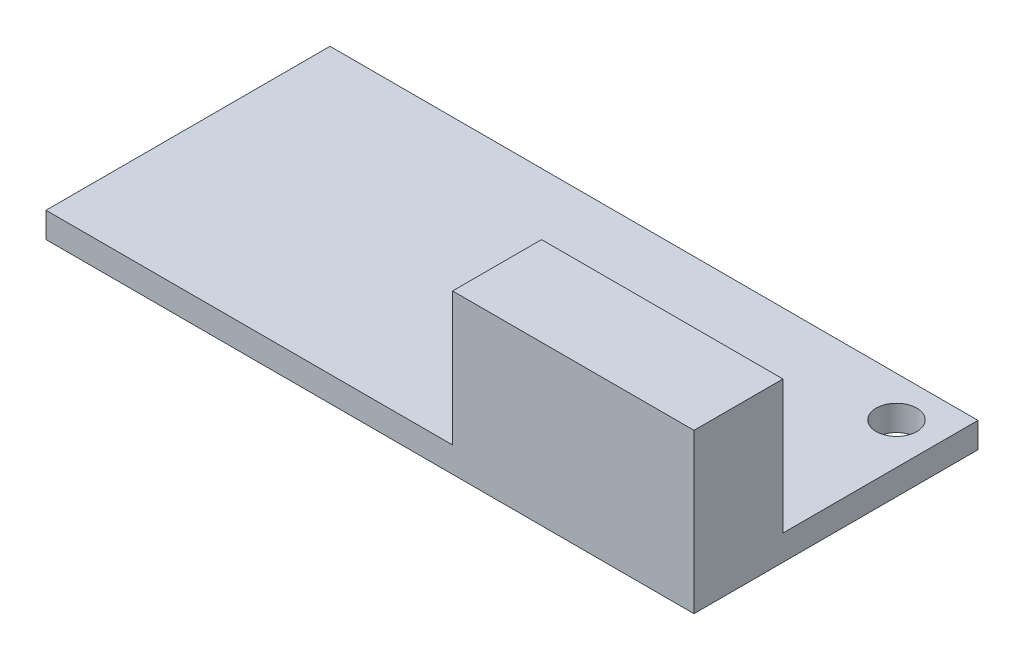
ISO-10303-21;
HEADER;
FILE_DESCRIPTION(('STEP AP214'),'2;1');
FILE_NAME('part.step','',(''),(''),'','','');
FILE_SCHEMA(('AUTOMOTIVE_DESIGN { 1 0 10303 214 1 1 1 1 }'));
ENDSEC;
DATA;
#1=APPLICATION_CONTEXT('core data for automotive mechanical design processes');
#2=APPLICATION_PROTOCOL_DEFINITION('international standard','automotive_design',2000,#1);
#3=PRODUCT_CONTEXT('',#1,'mechanical');
#4=PRODUCT('Part','Part','',(#3));
#5=PRODUCT_RELATED_PRODUCT_CATEGORY('part','',(#4));
#6=PRODUCT_DEFINITION_FORMATION('','',#4);
#7=PRODUCT_DEFINITION_CONTEXT('part definition',#1,'design');
#8=PRODUCT_DEFINITION('design','',#6,#7);
#9=PRODUCT_DEFINITION_SHAPE('','',#8);
#10=(LENGTH_UNIT() NAMED_UNIT(*) SI_UNIT(.MILLI.,.METRE.));
#11=(NAMED_UNIT(*) PLANE_ANGLE_UNIT() SI_UNIT($,.RADIAN.));
#12=(NAMED_UNIT(*) SI_UNIT($,.STERADIAN.) SOLID_ANGLE_UNIT());
#13=UNCERTAINTY_MEASURE_WITH_UNIT(LENGTH_MEASURE(1.E-05),#10,'distance_accuracy_value','');
#14=(GEOMETRIC_REPRESENTATION_CONTEXT(3) GLOBAL_UNCERTAINTY_ASSIGNED_CONTEXT((#13)) GLOBAL_UNIT_ASSIGNED_CONTEXT((#10,
#11,#12)) REPRESENTATION_CONTEXT('',''));
#15=CARTESIAN_POINT('',(0.,0.,0.));
#16=DIRECTION('',(0.,0.,1.));
#17=DIRECTION('',(1.,0.,0.));
#18=AXIS2_PLACEMENT_3D('',#15,#16,#17);
#19=CARTESIAN_POINT('',(0.,2.,0.));
#20=DIRECTION('',(0.,-1.,0.));
#21=DIRECTION('',(0.,0.,-1.));
#22=AXIS2_PLACEMENT_3D('',#19,#20,#21);
#23=PLANE('',#22);
#24=CARTESIAN_POINT('',(22.252,2.,-8.00556240259456));
#25=DIRECTION('',(0.,1.,0.));
#26=DIRECTION('',(0.,0.,1.));
#27=AXIS2_PLACEMENT_3D('',#24,#25,#26);
#28=CIRCLE('',#27,1.6);
#29=CARTESIAN_POINT('',(22.252,2.,-6.40556240259456));
#30=VERTEX_POINT('',#29);
#31=EDGE_CURVE('E174',#30,#30,#28,.T.);
#32=ORIENTED_EDGE('',*,*,#31,.F.);
#33=EDGE_LOOP('',(#32));
#34=FACE_BOUND('',#33,.T.);
#35=DIRECTION('',(0.,0.,1.));
#36=VECTOR('',#35,1.);
#37=CARTESIAN_POINT('',(6.5,2.,11.176));
#38=LINE('',#37,#36);
#39=CARTESIAN_POINT('',(6.5,2.,4.17600000000001));
#40=VERTEX_POINT('',#39);
#41=CARTESIAN_POINT('',(6.5,2.,11.176));
#42=VERTEX_POINT('',#41);
#43=EDGE_CURVE('E153',#40,#42,#38,.T.);
#44=ORIENTED_EDGE('',*,*,#43,.F.);
#45=DIRECTION('',(-1.,0.,0.));
#46=VECTOR('',#45,1.);
#47=CARTESIAN_POINT('',(25.5,2.,4.176));
#48=LINE('',#47,#46);
#49=CARTESIAN_POINT('',(25.5,2.,4.176));
#50=VERTEX_POINT('',#49);
#51=EDGE_CURVE('E148',#50,#40,#48,.T.);
#52=ORIENTED_EDGE('',*,*,#51,.F.);
#53=DIRECTION('',(0.,0.,-1.));
#54=VECTOR('',#53,1.);
#55=CARTESIAN_POINT('',(25.5,2.,11.176));
#56=LINE('',#55,#54);
#57=CARTESIAN_POINT('',(25.5,2.,-11.176));
#58=VERTEX_POINT('',#57);
#59=EDGE_CURVE('E180',#50,#58,#56,.T.);
#60=ORIENTED_EDGE('',*,*,#59,.T.);
#61=DIRECTION('',(-1.,0.,0.));
#62=VECTOR('',#61,1.);
#63=CARTESIAN_POINT('',(-25.5,2.,-11.176));
#64=LINE('',#63,#62);
#65=CARTESIAN_POINT('',(-25.5,2.,-11.176));
#66=VERTEX_POINT('',#65);
#67=EDGE_CURVE('E182',#58,#66,#64,.T.);
#68=ORIENTED_EDGE('',*,*,#67,.T.);
#69=DIRECTION('',(0.,0.,1.));
#70=VECTOR('',#69,1.);
#71=CARTESIAN_POINT('',(-25.5,2.,11.176));
#72=LINE('',#71,#70);
#73=CARTESIAN_POINT('',(-25.5,2.,11.176));
#74=VERTEX_POINT('',#73);
#75=EDGE_CURVE('E118',#66,#74,#72,.T.);
#76=ORIENTED_EDGE('',*,*,#75,.T.);
#77=DIRECTION('',(1.,0.,0.));
#78=VECTOR('',#77,1.);
#79=CARTESIAN_POINT('',(-25.5,2.,11.176));
#80=LINE('',#79,#78);
#81=EDGE_CURVE('E186',#74,#42,#80,.T.);
#82=ORIENTED_EDGE('',*,*,#81,.T.);
#83=EDGE_LOOP('',(#44,#52,#60,#68,#76,#82));
#84=FACE_BOUND('',#83,.T.);
#85=ADVANCED_FACE('F35',(#34,#84),#23,.F.);
#86=CARTESIAN_POINT('',(0.,0.,0.));
#87=DIRECTION('',(0.,-1.,0.));
#88=DIRECTION('',(0.,0.,-1.));
#89=AXIS2_PLACEMENT_3D('',#86,#87,#88);
#90=PLANE('',#89);
#91=DIRECTION('',(-1.,0.,0.));
#92=VECTOR('',#91,1.);
#93=CARTESIAN_POINT('',(-25.5,0.,-3.556));
#94=LINE('',#93,#92);
#95=CARTESIAN_POINT('',(17.68,0.,-3.556));
#96=VERTEX_POINT('',#95);
#97=CARTESIAN_POINT('',(-25.5,0.,-3.556));
#98=VERTEX_POINT('',#97);
#99=EDGE_CURVE('E135',#96,#98,#94,.T.);
#100=ORIENTED_EDGE('',*,*,#99,.F.);
#101=DIRECTION('',(0.,0.,1.));
#102=VECTOR('',#101,1.);
#103=CARTESIAN_POINT('',(17.68,0.,-11.176));
#104=LINE('',#103,#102);
#105=CARTESIAN_POINT('',(17.68,0.,-11.176));
#106=VERTEX_POINT('',#105);
#107=EDGE_CURVE('E50',#106,#96,#104,.T.);
#108=ORIENTED_EDGE('',*,*,#107,.F.);
#109=DIRECTION('',(-1.,0.,0.));
#110=VECTOR('',#109,1.);
#111=CARTESIAN_POINT('',(-25.5,0.,-11.176));
#112=LINE('',#111,#110);
#113=CARTESIAN_POINT('',(25.5,0.,-11.176));
#114=VERTEX_POINT('',#113);
#115=EDGE_CURVE('E191',#114,#106,#112,.T.);
#116=ORIENTED_EDGE('',*,*,#115,.F.);
#117=DIRECTION('',(0.,0.,-1.));
#118=VECTOR('',#117,1.);
#119=CARTESIAN_POINT('',(25.5,0.,11.176));
#120=LINE('',#119,#118);
#121=CARTESIAN_POINT('',(25.5,0.,11.176));
#122=VERTEX_POINT('',#121);
#123=EDGE_CURVE('E177',#122,#114,#120,.T.);
#124=ORIENTED_EDGE('',*,*,#123,.F.);
#125=DIRECTION('',(1.,0.,0.));
#126=VECTOR('',#125,1.);
#127=CARTESIAN_POINT('',(-25.5,0.,11.176));
#128=LINE('',#127,#126);
#129=CARTESIAN_POINT('',(-25.5,0.,11.176));
#130=VERTEX_POINT('',#129);
#131=EDGE_CURVE('E183',#130,#122,#128,.T.);
#132=ORIENTED_EDGE('',*,*,#131,.F.);
#133=DIRECTION('',(0.,0.,1.));
#134=VECTOR('',#133,1.);
#135=CARTESIAN_POINT('',(-25.5,0.,11.176));
#136=LINE('',#135,#134);
#137=EDGE_CURVE('E56',#98,#130,#136,.T.);
#138=ORIENTED_EDGE('',*,*,#137,.F.);
#139=EDGE_LOOP('',(#100,#108,#116,#124,#132,#138));
#140=FACE_BOUND('',#139,.T.);
#141=CARTESIAN_POINT('',(22.252,0.,-8.00556240259456));
#142=DIRECTION('',(0.,1.,0.));
#143=DIRECTION('',(0.,0.,1.));
#144=AXIS2_PLACEMENT_3D('',#141,#142,#143);
#145=CIRCLE('',#144,1.6);
#146=CARTESIAN_POINT('',(22.252,0.,-6.40556240259456));
#147=VERTEX_POINT('',#146);
#148=EDGE_CURVE('E173',#147,#147,#145,.T.);
#149=ORIENTED_EDGE('',*,*,#148,.T.);
#150=EDGE_LOOP('',(#149));
#151=FACE_BOUND('',#150,.T.);
#152=ADVANCED_FACE('F202',(#140,#151),#90,.T.);
#153=CARTESIAN_POINT('',(25.5,2.,11.176));
#154=DIRECTION('',(-1.,0.,0.));
#155=DIRECTION('',(0.,0.,1.));
#156=AXIS2_PLACEMENT_3D('',#153,#154,#155);
#157=PLANE('',#156);
#158=ORIENTED_EDGE('',*,*,#123,.T.);
#159=DIRECTION('',(0.,-1.,0.));
#160=VECTOR('',#159,1.);
#161=CARTESIAN_POINT('',(25.5,2.,-11.176));
#162=LINE('',#161,#160);
#163=EDGE_CURVE('E11',#58,#114,#162,.T.);
#164=ORIENTED_EDGE('',*,*,#163,.F.);
#165=ORIENTED_EDGE('',*,*,#59,.F.);
#166=DIRECTION('',(0.,-1.,0.));
#167=VECTOR('',#166,1.);
#168=CARTESIAN_POINT('',(25.5,12.5,4.176));
#169=LINE('',#168,#167);
#170=CARTESIAN_POINT('',(25.5,12.5,4.176));
#171=VERTEX_POINT('',#170);
#172=EDGE_CURVE('E170',#171,#50,#169,.T.);
#173=ORIENTED_EDGE('',*,*,#172,.F.);
#174=DIRECTION('',(0.,0.,-1.));
#175=VECTOR('',#174,1.);
#176=CARTESIAN_POINT('',(25.5,12.5,11.176));
#177=LINE('',#176,#175);
#178=CARTESIAN_POINT('',(25.5,12.5,11.176));
#179=VERTEX_POINT('',#178);
#180=EDGE_CURVE('E149',#179,#171,#177,.T.);
#181=ORIENTED_EDGE('',*,*,#180,.F.);
#182=DIRECTION('',(0.,-1.,0.));
#183=VECTOR('',#182,1.);
#184=CARTESIAN_POINT('',(25.5,2.,11.176));
#185=LINE('',#184,#183);
#186=EDGE_CURVE('E188',#179,#122,#185,.T.);
#187=ORIENTED_EDGE('',*,*,#186,.T.);
#188=EDGE_LOOP('',(#158,#164,#165,#173,#181,#187));
#189=FACE_BOUND('',#188,.T.);
#190=ADVANCED_FACE('F37',(#189),#157,.F.);
#191=CARTESIAN_POINT('',(-25.5,2.,-11.176));
#192=DIRECTION('',(0.,0.,1.));
#193=DIRECTION('',(1.,0.,0.));
#194=AXIS2_PLACEMENT_3D('',#191,#192,#193);
#195=PLANE('',#194);
#196=ORIENTED_EDGE('',*,*,#115,.T.);
#197=DIRECTION('',(0.,1.,0.));
#198=VECTOR('',#197,1.);
#199=CARTESIAN_POINT('',(17.68,-4.5,-11.176));
#200=LINE('',#199,#198);
#201=CARTESIAN_POINT('',(17.68,-4.5,-11.176));
#202=VERTEX_POINT('',#201);
#203=EDGE_CURVE('E126',#202,#106,#200,.T.);
#204=ORIENTED_EDGE('',*,*,#203,.F.);
#205=DIRECTION('',(1.,0.,0.));
#206=VECTOR('',#205,1.);
#207=CARTESIAN_POINT('',(-25.5,-4.5,-11.176));
#208=LINE('',#207,#206);
#209=CARTESIAN_POINT('',(-25.5,-4.5,-11.176));
#210=VERTEX_POINT('',#209);
#211=EDGE_CURVE('E123',#210,#202,#208,.T.);
#212=ORIENTED_EDGE('',*,*,#211,.F.);
#213=DIRECTION('',(0.,-1.,0.));
#214=VECTOR('',#213,1.);
#215=CARTESIAN_POINT('',(-25.5,2.,-11.176));
#216=LINE('',#215,#214);
#217=EDGE_CURVE('E43',#66,#210,#216,.T.);
#218=ORIENTED_EDGE('',*,*,#217,.F.);
#219=ORIENTED_EDGE('',*,*,#67,.F.);
#220=ORIENTED_EDGE('',*,*,#163,.T.);
#221=EDGE_LOOP('',(#196,#204,#212,#218,#219,#220));
#222=FACE_BOUND('',#221,.T.);
#223=ADVANCED_FACE('F124',(#222),#195,.F.);
#224=CARTESIAN_POINT('',(-25.5,2.,11.176));
#225=DIRECTION('',(1.,0.,0.));
#226=DIRECTION('',(0.,0.,-1.));
#227=AXIS2_PLACEMENT_3D('',#224,#225,#226);
#228=PLANE('',#227);
#229=ORIENTED_EDGE('',*,*,#217,.T.);
#230=DIRECTION('',(0.,0.,-1.));
#231=VECTOR('',#230,1.);
#232=CARTESIAN_POINT('',(-25.5,-4.5,-11.176));
#233=LINE('',#232,#231);
#234=CARTESIAN_POINT('',(-25.5,-4.5,-3.556));
#235=VERTEX_POINT('',#234);
#236=EDGE_CURVE('E116',#235,#210,#233,.T.);
#237=ORIENTED_EDGE('',*,*,#236,.F.);
#238=DIRECTION('',(0.,1.,0.));
#239=VECTOR('',#238,1.);
#240=CARTESIAN_POINT('',(-25.5,-4.5,-3.556));
#241=LINE('',#240,#239);
#242=EDGE_CURVE('E141',#235,#98,#241,.T.);
#243=ORIENTED_EDGE('',*,*,#242,.T.);
#244=ORIENTED_EDGE('',*,*,#137,.T.);
#245=DIRECTION('',(0.,-1.,0.));
#246=VECTOR('',#245,1.);
#247=CARTESIAN_POINT('',(-25.5,2.,11.176));
#248=LINE('',#247,#246);
#249=EDGE_CURVE('E121',#74,#130,#248,.T.);
#250=ORIENTED_EDGE('',*,*,#249,.F.);
#251=ORIENTED_EDGE('',*,*,#75,.F.);
#252=EDGE_LOOP('',(#229,#237,#243,#244,#250,#251));
#253=FACE_BOUND('',#252,.T.);
#254=ADVANCED_FACE('F113',(#253),#228,.F.);
#255=CARTESIAN_POINT('',(-25.5,2.,11.176));
#256=DIRECTION('',(0.,0.,-1.));
#257=DIRECTION('',(-1.,0.,0.));
#258=AXIS2_PLACEMENT_3D('',#255,#256,#257);
#259=PLANE('',#258);
#260=ORIENTED_EDGE('',*,*,#131,.T.);
#261=ORIENTED_EDGE('',*,*,#186,.F.);
#262=DIRECTION('',(1.,0.,0.));
#263=VECTOR('',#262,1.);
#264=CARTESIAN_POINT('',(25.5,12.5,11.176));
#265=LINE('',#264,#263);
#266=CARTESIAN_POINT('',(6.5,12.5,11.176));
#267=VERTEX_POINT('',#266);
#268=EDGE_CURVE('E157',#267,#179,#265,.T.);
#269=ORIENTED_EDGE('',*,*,#268,.F.);
#270=DIRECTION('',(0.,-1.,0.));
#271=VECTOR('',#270,1.);
#272=CARTESIAN_POINT('',(6.5,12.5,11.176));
#273=LINE('',#272,#271);
#274=EDGE_CURVE('E160',#267,#42,#273,.T.);
#275=ORIENTED_EDGE('',*,*,#274,.T.);
#276=ORIENTED_EDGE('',*,*,#81,.F.);
#277=ORIENTED_EDGE('',*,*,#249,.T.);
#278=EDGE_LOOP('',(#260,#261,#269,#275,#276,#277));
#279=FACE_BOUND('',#278,.T.);
#280=ADVANCED_FACE('F200',(#279),#259,.F.);
#281=CARTESIAN_POINT('',(22.252,2.,-8.00556240259456));
#282=DIRECTION('',(0.,-1.,0.));
#283=DIRECTION('',(0.,0.,-1.));
#284=AXIS2_PLACEMENT_3D('',#281,#282,#283);
#285=CYLINDRICAL_SURFACE('',#284,1.6);
#286=ORIENTED_EDGE('',*,*,#31,.T.);
#287=EDGE_LOOP('',(#286));
#288=FACE_BOUND('',#287,.T.);
#289=ORIENTED_EDGE('',*,*,#148,.F.);
#290=EDGE_LOOP('',(#289));
#291=FACE_BOUND('',#290,.T.);
#292=ADVANCED_FACE('F242',(#288,#291),#285,.F.);
#293=CARTESIAN_POINT('',(25.5,12.5,4.176));
#294=DIRECTION('',(0.,0.,1.));
#295=DIRECTION('',(1.,0.,0.));
#296=AXIS2_PLACEMENT_3D('',#293,#294,#295);
#297=PLANE('',#296);
#298=ORIENTED_EDGE('',*,*,#51,.T.);
#299=DIRECTION('',(0.,-1.,0.));
#300=VECTOR('',#299,1.);
#301=CARTESIAN_POINT('',(6.5,12.5,4.17600000000001));
#302=LINE('',#301,#300);
#303=CARTESIAN_POINT('',(6.5,12.5,4.17600000000001));
#304=VERTEX_POINT('',#303);
#305=EDGE_CURVE('E167',#304,#40,#302,.T.);
#306=ORIENTED_EDGE('',*,*,#305,.F.);
#307=DIRECTION('',(-1.,0.,0.));
#308=VECTOR('',#307,1.);
#309=CARTESIAN_POINT('',(25.5,12.5,4.176));
#310=LINE('',#309,#308);
#311=EDGE_CURVE('E152',#171,#304,#310,.T.);
#312=ORIENTED_EDGE('',*,*,#311,.F.);
#313=ORIENTED_EDGE('',*,*,#172,.T.);
#314=EDGE_LOOP('',(#298,#306,#312,#313));
#315=FACE_BOUND('',#314,.T.);
#316=ADVANCED_FACE('F219',(#315),#297,.F.);
#317=CARTESIAN_POINT('',(6.5,12.5,11.176));
#318=DIRECTION('',(1.,0.,0.));
#319=DIRECTION('',(0.,0.,-1.));
#320=AXIS2_PLACEMENT_3D('',#317,#318,#319);
#321=PLANE('',#320);
#322=ORIENTED_EDGE('',*,*,#43,.T.);
#323=ORIENTED_EDGE('',*,*,#274,.F.);
#324=DIRECTION('',(0.,0.,1.));
#325=VECTOR('',#324,1.);
#326=CARTESIAN_POINT('',(6.5,12.5,11.176));
#327=LINE('',#326,#325);
#328=EDGE_CURVE('E155',#304,#267,#327,.T.);
#329=ORIENTED_EDGE('',*,*,#328,.F.);
#330=ORIENTED_EDGE('',*,*,#305,.T.);
#331=EDGE_LOOP('',(#322,#323,#329,#330));
#332=FACE_BOUND('',#331,.T.);
#333=ADVANCED_FACE('F216',(#332),#321,.F.);
#334=CARTESIAN_POINT('',(0.,12.5,0.));
#335=DIRECTION('',(0.,1.,0.));
#336=DIRECTION('',(0.,0.,1.));
#337=AXIS2_PLACEMENT_3D('',#334,#335,#336);
#338=PLANE('',#337);
#339=ORIENTED_EDGE('',*,*,#180,.T.);
#340=ORIENTED_EDGE('',*,*,#311,.T.);
#341=ORIENTED_EDGE('',*,*,#328,.T.);
#342=ORIENTED_EDGE('',*,*,#268,.T.);
#343=EDGE_LOOP('',(#339,#340,#341,#342));
#344=FACE_BOUND('',#343,.T.);
#345=ADVANCED_FACE('F211',(#344),#338,.T.);
#346=CARTESIAN_POINT('',(17.68,-4.5,-11.176));
#347=DIRECTION('',(-1.,0.,0.));
#348=DIRECTION('',(0.,0.,1.));
#349=AXIS2_PLACEMENT_3D('',#346,#347,#348);
#350=PLANE('',#349);
#351=ORIENTED_EDGE('',*,*,#107,.T.);
#352=DIRECTION('',(0.,1.,0.));
#353=VECTOR('',#352,1.);
#354=CARTESIAN_POINT('',(17.68,-4.5,-3.556));
#355=LINE('',#354,#353);
#356=CARTESIAN_POINT('',(17.68,-4.5,-3.556));
#357=VERTEX_POINT('',#356);
#358=EDGE_CURVE('E144',#357,#96,#355,.T.);
#359=ORIENTED_EDGE('',*,*,#358,.F.);
#360=DIRECTION('',(0.,0.,1.));
#361=VECTOR('',#360,1.);
#362=CARTESIAN_POINT('',(17.68,-4.5,-11.176));
#363=LINE('',#362,#361);
#364=EDGE_CURVE('E129',#202,#357,#363,.T.);
#365=ORIENTED_EDGE('',*,*,#364,.F.);
#366=ORIENTED_EDGE('',*,*,#203,.T.);
#367=EDGE_LOOP('',(#351,#359,#365,#366));
#368=FACE_BOUND('',#367,.T.);
#369=ADVANCED_FACE('F221',(#368),#350,.F.);
#370=CARTESIAN_POINT('',(-25.5,-4.5,-3.556));
#371=DIRECTION('',(0.,0.,-1.));
#372=DIRECTION('',(-1.,0.,0.));
#373=AXIS2_PLACEMENT_3D('',#370,#371,#372);
#374=PLANE('',#373);
#375=ORIENTED_EDGE('',*,*,#99,.T.);
#376=ORIENTED_EDGE('',*,*,#242,.F.);
#377=DIRECTION('',(-1.,0.,0.));
#378=VECTOR('',#377,1.);
#379=CARTESIAN_POINT('',(-25.5,-4.5,-3.556));
#380=LINE('',#379,#378);
#381=EDGE_CURVE('E133',#357,#235,#380,.T.);
#382=ORIENTED_EDGE('',*,*,#381,.F.);
#383=ORIENTED_EDGE('',*,*,#358,.T.);
#384=EDGE_LOOP('',(#375,#376,#382,#383));
#385=FACE_BOUND('',#384,.T.);
#386=ADVANCED_FACE('F224',(#385),#374,.F.);
#387=CARTESIAN_POINT('',(0.,-4.5,0.));
#388=DIRECTION('',(0.,1.,0.));
#389=DIRECTION('',(0.,0.,1.));
#390=AXIS2_PLACEMENT_3D('',#387,#388,#389);
#391=PLANE('',#390);
#392=ORIENTED_EDGE('',*,*,#236,.T.);
#393=ORIENTED_EDGE('',*,*,#211,.T.);
#394=ORIENTED_EDGE('',*,*,#364,.T.);
#395=ORIENTED_EDGE('',*,*,#381,.T.);
#396=EDGE_LOOP('',(#392,#393,#394,#395));
#397=FACE_BOUND('',#396,.T.);
#398=ADVANCED_FACE('F131',(#397),#391,.F.);
#399=CLOSED_SHELL('',(#85,#152,#190,#223,#254,#280,#292,#316,#333,#345,#369,#386,#398));
#400=MANIFOLD_SOLID_BREP('B2',#399);
#401=ADVANCED_BREP_SHAPE_REPRESENTATION('',(#18,#400),#14);
#402=SHAPE_DEFINITION_REPRESENTATION(#9,#401);
ENDSEC;
END-ISO-10303-21;
